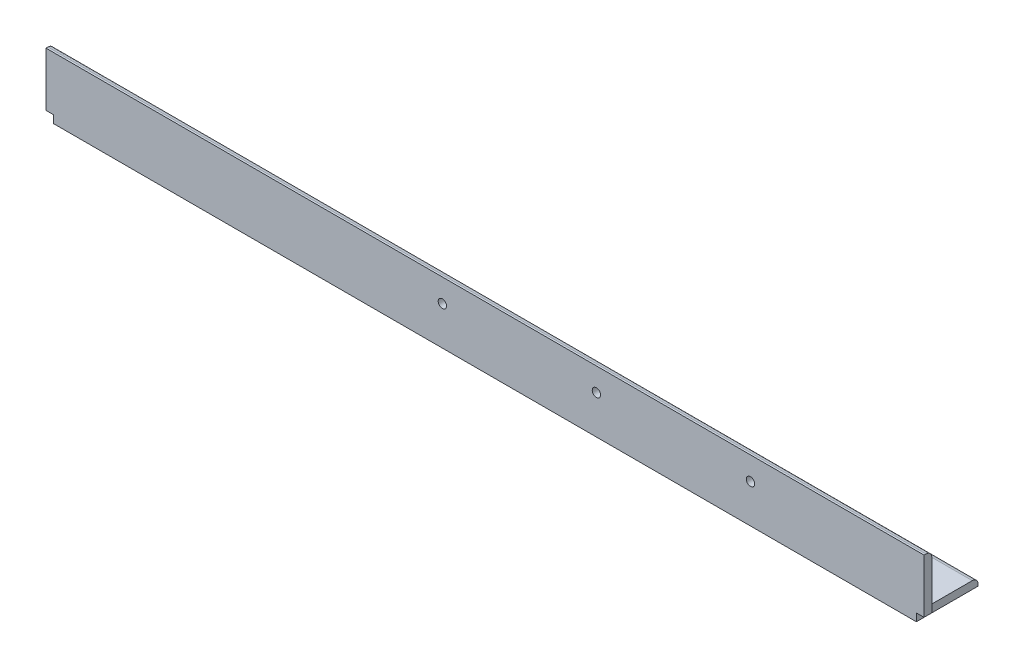
ISO-10303-21;
HEADER;
FILE_DESCRIPTION(('STEP AP214'),'2;1');
FILE_NAME('part.step','',(''),(''),'','','');
FILE_SCHEMA(('AUTOMOTIVE_DESIGN { 1 0 10303 214 1 1 1 1 }'));
ENDSEC;
DATA;
#1=APPLICATION_CONTEXT('core data for automotive mechanical design processes');
#2=APPLICATION_PROTOCOL_DEFINITION('international standard','automotive_design',2000,#1);
#3=PRODUCT_CONTEXT('',#1,'mechanical');
#4=PRODUCT('Part','Part','',(#3));
#5=PRODUCT_RELATED_PRODUCT_CATEGORY('part','',(#4));
#6=PRODUCT_DEFINITION_FORMATION('','',#4);
#7=PRODUCT_DEFINITION_CONTEXT('part definition',#1,'design');
#8=PRODUCT_DEFINITION('design','',#6,#7);
#9=PRODUCT_DEFINITION_SHAPE('','',#8);
#10=(LENGTH_UNIT() NAMED_UNIT(*) SI_UNIT(.MILLI.,.METRE.));
#11=(NAMED_UNIT(*) PLANE_ANGLE_UNIT() SI_UNIT($,.RADIAN.));
#12=(NAMED_UNIT(*) SI_UNIT($,.STERADIAN.) SOLID_ANGLE_UNIT());
#13=UNCERTAINTY_MEASURE_WITH_UNIT(LENGTH_MEASURE(1.E-05),#10,'distance_accuracy_value','');
#14=(GEOMETRIC_REPRESENTATION_CONTEXT(3) GLOBAL_UNCERTAINTY_ASSIGNED_CONTEXT((#13)) GLOBAL_UNIT_ASSIGNED_CONTEXT((#10,
#11,#12)) REPRESENTATION_CONTEXT('',''));
#15=CARTESIAN_POINT('',(0.,0.,0.));
#16=DIRECTION('',(0.,0.,1.));
#17=DIRECTION('',(1.,0.,0.));
#18=AXIS2_PLACEMENT_3D('',#15,#16,#17);
#19=CARTESIAN_POINT('',(180.975,0.,-25.4));
#20=DIRECTION('',(0.,1.,0.));
#21=DIRECTION('',(0.,0.,1.));
#22=AXIS2_PLACEMENT_3D('',#19,#20,#21);
#23=PLANE('',#22);
#24=CARTESIAN_POINT('',(-131.953,0.,-13.335));
#25=DIRECTION('',(0.,1.,0.));
#26=DIRECTION('',(0.,0.,1.));
#27=AXIS2_PLACEMENT_3D('',#24,#25,#26);
#28=CIRCLE('',#27,1.72719999999998);
#29=CARTESIAN_POINT('',(-131.953,0.,-11.6078));
#30=VERTEX_POINT('',#29);
#31=EDGE_CURVE('E334',#30,#30,#28,.T.);
#32=ORIENTED_EDGE('',*,*,#31,.T.);
#33=EDGE_LOOP('',(#32));
#34=FACE_BOUND('',#33,.T.);
#35=CARTESIAN_POINT('',(131.953,0.,-13.335));
#36=DIRECTION('',(0.,1.,0.));
#37=DIRECTION('',(0.,0.,1.));
#38=AXIS2_PLACEMENT_3D('',#35,#36,#37);
#39=CIRCLE('',#38,1.72719999999998);
#40=CARTESIAN_POINT('',(131.953,0.,-11.6078));
#41=VERTEX_POINT('',#40);
#42=EDGE_CURVE('E333',#41,#41,#39,.T.);
#43=ORIENTED_EDGE('',*,*,#42,.T.);
#44=EDGE_LOOP('',(#43));
#45=FACE_BOUND('',#44,.T.);
#46=DIRECTION('',(0.,0.,-1.));
#47=VECTOR('',#46,1.);
#48=CARTESIAN_POINT('',(-177.8,0.,0.));
#49=LINE('',#48,#47);
#50=CARTESIAN_POINT('',(-177.8,0.,0.));
#51=VERTEX_POINT('',#50);
#52=CARTESIAN_POINT('',(-177.8,0.,-25.4));
#53=VERTEX_POINT('',#52);
#54=EDGE_CURVE('E134',#51,#53,#49,.T.);
#55=ORIENTED_EDGE('',*,*,#54,.T.);
#56=DIRECTION('',(-1.,0.,0.));
#57=VECTOR('',#56,1.);
#58=CARTESIAN_POINT('',(180.975,0.,-25.4));
#59=LINE('',#58,#57);
#60=CARTESIAN_POINT('',(177.8,0.,-25.4));
#61=VERTEX_POINT('',#60);
#62=EDGE_CURVE('E203',#61,#53,#59,.T.);
#63=ORIENTED_EDGE('',*,*,#62,.F.);
#64=DIRECTION('',(0.,0.,-1.));
#65=VECTOR('',#64,1.);
#66=CARTESIAN_POINT('',(177.8,0.,0.));
#67=LINE('',#66,#65);
#68=CARTESIAN_POINT('',(177.8,0.,0.));
#69=VERTEX_POINT('',#68);
#70=EDGE_CURVE('E172',#69,#61,#67,.T.);
#71=ORIENTED_EDGE('',*,*,#70,.F.);
#72=DIRECTION('',(-1.,0.,0.));
#73=VECTOR('',#72,1.);
#74=CARTESIAN_POINT('',(180.975,0.,0.));
#75=LINE('',#74,#73);
#76=EDGE_CURVE('E191',#69,#51,#75,.T.);
#77=ORIENTED_EDGE('',*,*,#76,.T.);
#78=EDGE_LOOP('',(#55,#63,#71,#77));
#79=FACE_BOUND('',#78,.T.);
#80=ADVANCED_FACE('F35',(#34,#45,#79),#23,.F.);
#81=CARTESIAN_POINT('',(180.975,3.175,-25.4));
#82=DIRECTION('',(0.,0.,1.));
#83=DIRECTION('',(1.,0.,0.));
#84=AXIS2_PLACEMENT_3D('',#81,#82,#83);
#85=PLANE('',#84);
#86=DIRECTION('',(0.,1.,0.));
#87=VECTOR('',#86,1.);
#88=CARTESIAN_POINT('',(-177.8,3.175,-25.4));
#89=LINE('',#88,#87);
#90=CARTESIAN_POINT('',(-177.8,0.812800000000003,-25.4));
#91=VERTEX_POINT('',#90);
#92=EDGE_CURVE('E155',#53,#91,#89,.T.);
#93=ORIENTED_EDGE('',*,*,#92,.T.);
#94=DIRECTION('',(-1.,0.,0.));
#95=VECTOR('',#94,1.);
#96=CARTESIAN_POINT('',(180.975,0.812800000000003,-25.4));
#97=LINE('',#96,#95);
#98=CARTESIAN_POINT('',(177.8,0.812800000000003,-25.4));
#99=VERTEX_POINT('',#98);
#100=EDGE_CURVE('E43',#91,#99,#97,.F.);
#101=ORIENTED_EDGE('',*,*,#100,.T.);
#102=DIRECTION('',(0.,1.,0.));
#103=VECTOR('',#102,1.);
#104=CARTESIAN_POINT('',(177.8,3.175,-25.4));
#105=LINE('',#104,#103);
#106=EDGE_CURVE('E165',#61,#99,#105,.T.);
#107=ORIENTED_EDGE('',*,*,#106,.F.);
#108=ORIENTED_EDGE('',*,*,#62,.T.);
#109=EDGE_LOOP('',(#93,#101,#107,#108));
#110=FACE_BOUND('',#109,.T.);
#111=ADVANCED_FACE('F254',(#110),#85,.F.);
#112=CARTESIAN_POINT('',(180.975,3.175,-3.175));
#113=DIRECTION('',(0.,-1.,0.));
#114=DIRECTION('',(0.,0.,-1.));
#115=AXIS2_PLACEMENT_3D('',#112,#113,#114);
#116=PLANE('',#115);
#117=CARTESIAN_POINT('',(-131.953,3.175,-13.335));
#118=DIRECTION('',(0.,1.,0.));
#119=DIRECTION('',(0.,0.,1.));
#120=AXIS2_PLACEMENT_3D('',#117,#118,#119);
#121=CIRCLE('',#120,1.72719999999998);
#122=CARTESIAN_POINT('',(-131.953,3.175,-11.6078));
#123=VERTEX_POINT('',#122);
#124=EDGE_CURVE('E329',#123,#123,#121,.T.);
#125=ORIENTED_EDGE('',*,*,#124,.F.);
#126=EDGE_LOOP('',(#125));
#127=FACE_BOUND('',#126,.T.);
#128=CARTESIAN_POINT('',(131.953,3.175,-13.335));
#129=DIRECTION('',(0.,1.,0.));
#130=DIRECTION('',(0.,0.,1.));
#131=AXIS2_PLACEMENT_3D('',#128,#129,#130);
#132=CIRCLE('',#131,1.72719999999998);
#133=CARTESIAN_POINT('',(131.953,3.175,-11.6078));
#134=VERTEX_POINT('',#133);
#135=EDGE_CURVE('E332',#134,#134,#132,.T.);
#136=ORIENTED_EDGE('',*,*,#135,.F.);
#137=EDGE_LOOP('',(#136));
#138=FACE_BOUND('',#137,.T.);
#139=DIRECTION('',(0.,0.,-1.));
#140=VECTOR('',#139,1.);
#141=CARTESIAN_POINT('',(177.8,3.175,0.));
#142=LINE('',#141,#140);
#143=CARTESIAN_POINT('',(177.8,3.175,-6.35));
#144=VERTEX_POINT('',#143);
#145=CARTESIAN_POINT('',(177.8,3.175,-23.0378));
#146=VERTEX_POINT('',#145);
#147=EDGE_CURVE('E181',#144,#146,#142,.T.);
#148=ORIENTED_EDGE('',*,*,#147,.T.);
#149=DIRECTION('',(-1.,0.,0.));
#150=VECTOR('',#149,1.);
#151=CARTESIAN_POINT('',(180.975,3.175,-23.0378));
#152=LINE('',#151,#150);
#153=CARTESIAN_POINT('',(-177.8,3.175,-23.0378));
#154=VERTEX_POINT('',#153);
#155=EDGE_CURVE('E229',#146,#154,#152,.T.);
#156=ORIENTED_EDGE('',*,*,#155,.T.);
#157=DIRECTION('',(0.,0.,-1.));
#158=VECTOR('',#157,1.);
#159=CARTESIAN_POINT('',(-177.8,3.175,0.));
#160=LINE('',#159,#158);
#161=CARTESIAN_POINT('',(-177.8,3.175,-6.35));
#162=VERTEX_POINT('',#161);
#163=EDGE_CURVE('E148',#162,#154,#160,.T.);
#164=ORIENTED_EDGE('',*,*,#163,.F.);
#165=DIRECTION('',(-1.,0.,0.));
#166=VECTOR('',#165,1.);
#167=CARTESIAN_POINT('',(177.8,3.175,-6.35));
#168=LINE('',#167,#166);
#169=EDGE_CURVE('E214',#162,#144,#168,.F.);
#170=ORIENTED_EDGE('',*,*,#169,.T.);
#171=EDGE_LOOP('',(#148,#156,#164,#170));
#172=FACE_BOUND('',#171,.T.);
#173=ADVANCED_FACE('F236',(#127,#138,#172),#116,.F.);
#174=CARTESIAN_POINT('',(180.975,0.,0.));
#175=DIRECTION('',(0.,0.,-1.));
#176=DIRECTION('',(-1.,0.,0.));
#177=AXIS2_PLACEMENT_3D('',#174,#175,#176);
#178=PLANE('',#177);
#179=CARTESIAN_POINT('',(109.4105,15.875,0.));
#180=DIRECTION('',(0.,0.,1.));
#181=DIRECTION('',(1.,0.,0.));
#182=AXIS2_PLACEMENT_3D('',#179,#180,#181);
#183=CIRCLE('',#182,1.72719999999998);
#184=CARTESIAN_POINT('',(111.1377,15.875,0.));
#185=VERTEX_POINT('',#184);
#186=EDGE_CURVE('E337',#185,#185,#183,.T.);
#187=ORIENTED_EDGE('',*,*,#186,.F.);
#188=EDGE_LOOP('',(#187));
#189=FACE_BOUND('',#188,.T.);
#190=CARTESIAN_POINT('',(45.9105,15.875,0.));
#191=DIRECTION('',(0.,0.,1.));
#192=DIRECTION('',(1.,0.,0.));
#193=AXIS2_PLACEMENT_3D('',#190,#191,#192);
#194=CIRCLE('',#193,1.72719999999998);
#195=CARTESIAN_POINT('',(47.6377,15.875,0.));
#196=VERTEX_POINT('',#195);
#197=EDGE_CURVE('E347',#196,#196,#194,.T.);
#198=ORIENTED_EDGE('',*,*,#197,.F.);
#199=EDGE_LOOP('',(#198));
#200=FACE_BOUND('',#199,.T.);
#201=CARTESIAN_POINT('',(-17.5895,15.875,0.));
#202=DIRECTION('',(0.,0.,1.));
#203=DIRECTION('',(1.,0.,0.));
#204=AXIS2_PLACEMENT_3D('',#201,#202,#203);
#205=CIRCLE('',#204,1.72719999999999);
#206=CARTESIAN_POINT('',(-15.8623,15.875,0.));
#207=VERTEX_POINT('',#206);
#208=EDGE_CURVE('E352',#207,#207,#205,.T.);
#209=ORIENTED_EDGE('',*,*,#208,.F.);
#210=EDGE_LOOP('',(#209));
#211=FACE_BOUND('',#210,.T.);
#212=DIRECTION('',(0.,1.,0.));
#213=VECTOR('',#212,1.);
#214=CARTESIAN_POINT('',(-177.8,3.175,0.));
#215=LINE('',#214,#213);
#216=CARTESIAN_POINT('',(-177.8,3.175,0.));
#217=VERTEX_POINT('',#216);
#218=EDGE_CURVE('E128',#51,#217,#215,.T.);
#219=ORIENTED_EDGE('',*,*,#218,.F.);
#220=ORIENTED_EDGE('',*,*,#76,.F.);
#221=DIRECTION('',(0.,1.,0.));
#222=VECTOR('',#221,1.);
#223=CARTESIAN_POINT('',(177.8,3.175,0.));
#224=LINE('',#223,#222);
#225=CARTESIAN_POINT('',(177.8,3.175,0.));
#226=VERTEX_POINT('',#225);
#227=EDGE_CURVE('E166',#69,#226,#224,.T.);
#228=ORIENTED_EDGE('',*,*,#227,.T.);
#229=DIRECTION('',(1.,0.,0.));
#230=VECTOR('',#229,1.);
#231=CARTESIAN_POINT('',(180.975,3.175,0.));
#232=LINE('',#231,#230);
#233=CARTESIAN_POINT('',(180.975,3.175,0.));
#234=VERTEX_POINT('',#233);
#235=EDGE_CURVE('E169',#226,#234,#232,.T.);
#236=ORIENTED_EDGE('',*,*,#235,.T.);
#237=DIRECTION('',(0.,-1.,0.));
#238=VECTOR('',#237,1.);
#239=CARTESIAN_POINT('',(180.975,0.,0.));
#240=LINE('',#239,#238);
#241=CARTESIAN_POINT('',(180.975,25.4,0.));
#242=VERTEX_POINT('',#241);
#243=EDGE_CURVE('E188',#242,#234,#240,.T.);
#244=ORIENTED_EDGE('',*,*,#243,.F.);
#245=DIRECTION('',(-1.,0.,0.));
#246=VECTOR('',#245,1.);
#247=CARTESIAN_POINT('',(180.975,25.4,0.));
#248=LINE('',#247,#246);
#249=CARTESIAN_POINT('',(-180.975,25.4,0.));
#250=VERTEX_POINT('',#249);
#251=EDGE_CURVE('E198',#242,#250,#248,.T.);
#252=ORIENTED_EDGE('',*,*,#251,.T.);
#253=DIRECTION('',(0.,-1.,0.));
#254=VECTOR('',#253,1.);
#255=CARTESIAN_POINT('',(-180.975,0.,0.));
#256=LINE('',#255,#254);
#257=CARTESIAN_POINT('',(-180.975,3.175,0.));
#258=VERTEX_POINT('',#257);
#259=EDGE_CURVE('E154',#250,#258,#256,.T.);
#260=ORIENTED_EDGE('',*,*,#259,.T.);
#261=DIRECTION('',(-1.,0.,0.));
#262=VECTOR('',#261,1.);
#263=CARTESIAN_POINT('',(-180.975,3.175,0.));
#264=LINE('',#263,#262);
#265=EDGE_CURVE('E140',#217,#258,#264,.T.);
#266=ORIENTED_EDGE('',*,*,#265,.F.);
#267=EDGE_LOOP('',(#219,#220,#228,#236,#244,#252,#260,#266));
#268=FACE_BOUND('',#267,.T.);
#269=ADVANCED_FACE('F151',(#189,#200,#211,#268),#178,.F.);
#270=CARTESIAN_POINT('',(-180.975,0.,0.));
#271=DIRECTION('',(-1.,0.,0.));
#272=DIRECTION('',(0.,0.,1.));
#273=AXIS2_PLACEMENT_3D('',#270,#271,#272);
#274=PLANE('',#273);
#275=DIRECTION('',(0.,0.,1.));
#276=VECTOR('',#275,1.);
#277=CARTESIAN_POINT('',(-180.975,25.4,0.));
#278=LINE('',#277,#276);
#279=CARTESIAN_POINT('',(-180.975,25.4,-0.8128));
#280=VERTEX_POINT('',#279);
#281=EDGE_CURVE('E194',#280,#250,#278,.T.);
#282=ORIENTED_EDGE('',*,*,#281,.F.);
#283=CARTESIAN_POINT('',(-180.975,23.0378,-0.8128));
#284=DIRECTION('',(-1.,0.,0.));
#285=DIRECTION('',(0.,0.,1.));
#286=AXIS2_PLACEMENT_3D('',#283,#284,#285);
#287=CIRCLE('',#286,2.3622);
#288=CARTESIAN_POINT('',(-180.975,23.0378,-3.175));
#289=VERTEX_POINT('',#288);
#290=EDGE_CURVE('E223',#280,#289,#287,.T.);
#291=ORIENTED_EDGE('',*,*,#290,.T.);
#292=DIRECTION('',(0.,1.,0.));
#293=VECTOR('',#292,1.);
#294=CARTESIAN_POINT('',(-180.975,25.4,-3.175));
#295=LINE('',#294,#293);
#296=CARTESIAN_POINT('',(-180.975,3.175,-3.175));
#297=VERTEX_POINT('',#296);
#298=EDGE_CURVE('E177',#297,#289,#295,.T.);
#299=ORIENTED_EDGE('',*,*,#298,.F.);
#300=DIRECTION('',(0.,0.,-1.));
#301=VECTOR('',#300,1.);
#302=CARTESIAN_POINT('',(-180.975,3.175,0.));
#303=LINE('',#302,#301);
#304=EDGE_CURVE('E139',#258,#297,#303,.T.);
#305=ORIENTED_EDGE('',*,*,#304,.F.);
#306=ORIENTED_EDGE('',*,*,#259,.F.);
#307=EDGE_LOOP('',(#282,#291,#299,#305,#306));
#308=FACE_BOUND('',#307,.T.);
#309=ADVANCED_FACE('F310',(#308),#274,.T.);
#310=CARTESIAN_POINT('',(180.975,25.4,-3.175));
#311=DIRECTION('',(0.,0.,1.));
#312=DIRECTION('',(1.,0.,0.));
#313=AXIS2_PLACEMENT_3D('',#310,#311,#312);
#314=PLANE('',#313);
#315=CARTESIAN_POINT('',(109.4105,15.875,-3.175));
#316=DIRECTION('',(0.,0.,1.));
#317=DIRECTION('',(1.,0.,0.));
#318=AXIS2_PLACEMENT_3D('',#315,#316,#317);
#319=CIRCLE('',#318,1.72719999999999);
#320=CARTESIAN_POINT('',(111.1377,15.875,-3.175));
#321=VERTEX_POINT('',#320);
#322=EDGE_CURVE('E344',#321,#321,#319,.T.);
#323=ORIENTED_EDGE('',*,*,#322,.T.);
#324=EDGE_LOOP('',(#323));
#325=FACE_BOUND('',#324,.T.);
#326=CARTESIAN_POINT('',(45.9105,15.875,-3.175));
#327=DIRECTION('',(0.,0.,1.));
#328=DIRECTION('',(1.,0.,0.));
#329=AXIS2_PLACEMENT_3D('',#326,#327,#328);
#330=CIRCLE('',#329,1.72719999999999);
#331=CARTESIAN_POINT('',(47.6377,15.875,-3.175));
#332=VERTEX_POINT('',#331);
#333=EDGE_CURVE('E350',#332,#332,#330,.T.);
#334=ORIENTED_EDGE('',*,*,#333,.T.);
#335=EDGE_LOOP('',(#334));
#336=FACE_BOUND('',#335,.T.);
#337=CARTESIAN_POINT('',(-17.5895,15.875,-3.175));
#338=DIRECTION('',(0.,0.,1.));
#339=DIRECTION('',(1.,0.,0.));
#340=AXIS2_PLACEMENT_3D('',#337,#338,#339);
#341=CIRCLE('',#340,1.72719999999999);
#342=CARTESIAN_POINT('',(-15.8623,15.875,-3.175));
#343=VERTEX_POINT('',#342);
#344=EDGE_CURVE('E157',#343,#343,#341,.T.);
#345=ORIENTED_EDGE('',*,*,#344,.T.);
#346=EDGE_LOOP('',(#345));
#347=FACE_BOUND('',#346,.T.);
#348=ORIENTED_EDGE('',*,*,#298,.T.);
#349=DIRECTION('',(-1.,0.,0.));
#350=VECTOR('',#349,1.);
#351=CARTESIAN_POINT('',(180.975,23.0378,-3.175));
#352=LINE('',#351,#350);
#353=CARTESIAN_POINT('',(180.975,23.0378,-3.175));
#354=VERTEX_POINT('',#353);
#355=EDGE_CURVE('E225',#289,#354,#352,.F.);
#356=ORIENTED_EDGE('',*,*,#355,.T.);
#357=DIRECTION('',(0.,1.,0.));
#358=VECTOR('',#357,1.);
#359=CARTESIAN_POINT('',(180.975,25.4,-3.175));
#360=LINE('',#359,#358);
#361=CARTESIAN_POINT('',(180.975,3.175,-3.175));
#362=VERTEX_POINT('',#361);
#363=EDGE_CURVE('E183',#362,#354,#360,.T.);
#364=ORIENTED_EDGE('',*,*,#363,.F.);
#365=DIRECTION('',(-1.,0.,0.));
#366=VECTOR('',#365,1.);
#367=CARTESIAN_POINT('',(180.975,3.175,-3.175));
#368=LINE('',#367,#366);
#369=CARTESIAN_POINT('',(177.8,3.175,-3.175));
#370=VERTEX_POINT('',#369);
#371=EDGE_CURVE('E200',#362,#370,#368,.T.);
#372=ORIENTED_EDGE('',*,*,#371,.T.);
#373=DIRECTION('',(0.,1.,0.));
#374=VECTOR('',#373,1.);
#375=CARTESIAN_POINT('',(177.8,3.175,-3.175));
#376=LINE('',#375,#374);
#377=CARTESIAN_POINT('',(177.8,6.35,-3.175));
#378=VERTEX_POINT('',#377);
#379=EDGE_CURVE('E206',#370,#378,#376,.T.);
#380=ORIENTED_EDGE('',*,*,#379,.T.);
#381=DIRECTION('',(-1.,0.,0.));
#382=VECTOR('',#381,1.);
#383=CARTESIAN_POINT('',(-177.8,6.35,-3.175));
#384=LINE('',#383,#382);
#385=CARTESIAN_POINT('',(-177.8,6.35,-3.175));
#386=VERTEX_POINT('',#385);
#387=EDGE_CURVE('E209',#378,#386,#384,.T.);
#388=ORIENTED_EDGE('',*,*,#387,.T.);
#389=DIRECTION('',(0.,-1.,0.));
#390=VECTOR('',#389,1.);
#391=CARTESIAN_POINT('',(-177.8,25.4,-3.175));
#392=LINE('',#391,#390);
#393=CARTESIAN_POINT('',(-177.8,3.175,-3.175));
#394=VERTEX_POINT('',#393);
#395=EDGE_CURVE('E212',#386,#394,#392,.T.);
#396=ORIENTED_EDGE('',*,*,#395,.T.);
#397=DIRECTION('',(1.,0.,0.));
#398=VECTOR('',#397,1.);
#399=CARTESIAN_POINT('',(180.975,3.175,-3.175));
#400=LINE('',#399,#398);
#401=EDGE_CURVE('E147',#297,#394,#400,.T.);
#402=ORIENTED_EDGE('',*,*,#401,.F.);
#403=EDGE_LOOP('',(#348,#356,#364,#372,#380,#388,#396,#402));
#404=FACE_BOUND('',#403,.T.);
#405=ADVANCED_FACE('F313',(#325,#336,#347,#404),#314,.F.);
#406=CARTESIAN_POINT('',(180.975,25.4,0.));
#407=DIRECTION('',(0.,-1.,0.));
#408=DIRECTION('',(0.,0.,-1.));
#409=AXIS2_PLACEMENT_3D('',#406,#407,#408);
#410=PLANE('',#409);
#411=DIRECTION('',(0.,0.,1.));
#412=VECTOR('',#411,1.);
#413=CARTESIAN_POINT('',(180.975,25.4,0.));
#414=LINE('',#413,#412);
#415=CARTESIAN_POINT('',(180.975,25.4,-0.8128));
#416=VERTEX_POINT('',#415);
#417=EDGE_CURVE('E186',#416,#242,#414,.T.);
#418=ORIENTED_EDGE('',*,*,#417,.F.);
#419=DIRECTION('',(-1.,0.,0.));
#420=VECTOR('',#419,1.);
#421=CARTESIAN_POINT('',(180.975,25.4,-0.8128));
#422=LINE('',#421,#420);
#423=EDGE_CURVE('E220',#416,#280,#422,.T.);
#424=ORIENTED_EDGE('',*,*,#423,.T.);
#425=ORIENTED_EDGE('',*,*,#281,.T.);
#426=ORIENTED_EDGE('',*,*,#251,.F.);
#427=EDGE_LOOP('',(#418,#424,#425,#426));
#428=FACE_BOUND('',#427,.T.);
#429=ADVANCED_FACE('F308',(#428),#410,.F.);
#430=CARTESIAN_POINT('',(180.975,0.,0.));
#431=DIRECTION('',(-1.,0.,0.));
#432=DIRECTION('',(0.,0.,1.));
#433=AXIS2_PLACEMENT_3D('',#430,#431,#432);
#434=PLANE('',#433);
#435=ORIENTED_EDGE('',*,*,#363,.T.);
#436=CARTESIAN_POINT('',(180.975,23.0378,-0.8128));
#437=DIRECTION('',(-1.,0.,0.));
#438=DIRECTION('',(0.,0.,1.));
#439=AXIS2_PLACEMENT_3D('',#436,#437,#438);
#440=CIRCLE('',#439,2.3622);
#441=EDGE_CURVE('E227',#354,#416,#440,.F.);
#442=ORIENTED_EDGE('',*,*,#441,.T.);
#443=ORIENTED_EDGE('',*,*,#417,.T.);
#444=ORIENTED_EDGE('',*,*,#243,.T.);
#445=DIRECTION('',(0.,0.,-1.));
#446=VECTOR('',#445,1.);
#447=CARTESIAN_POINT('',(180.975,3.175,0.));
#448=LINE('',#447,#446);
#449=EDGE_CURVE('E174',#234,#362,#448,.T.);
#450=ORIENTED_EDGE('',*,*,#449,.T.);
#451=EDGE_LOOP('',(#435,#442,#443,#444,#450));
#452=FACE_BOUND('',#451,.T.);
#453=ADVANCED_FACE('F303',(#452),#434,.F.);
#454=CARTESIAN_POINT('',(180.975,3.175,0.));
#455=DIRECTION('',(0.,1.,0.));
#456=DIRECTION('',(0.,0.,1.));
#457=AXIS2_PLACEMENT_3D('',#454,#455,#456);
#458=PLANE('',#457);
#459=ORIENTED_EDGE('',*,*,#449,.F.);
#460=ORIENTED_EDGE('',*,*,#235,.F.);
#461=EDGE_CURVE('E178',#226,#370,#142,.T.);
#462=ORIENTED_EDGE('',*,*,#461,.T.);
#463=ORIENTED_EDGE('',*,*,#371,.F.);
#464=EDGE_LOOP('',(#459,#460,#462,#463));
#465=FACE_BOUND('',#464,.T.);
#466=ADVANCED_FACE('F300',(#465),#458,.F.);
#467=CARTESIAN_POINT('',(177.8,3.175,0.));
#468=DIRECTION('',(-1.,0.,0.));
#469=DIRECTION('',(0.,0.,1.));
#470=AXIS2_PLACEMENT_3D('',#467,#468,#469);
#471=PLANE('',#470);
#472=ORIENTED_EDGE('',*,*,#106,.T.);
#473=CARTESIAN_POINT('',(177.8,0.812800000000003,-23.0378));
#474=DIRECTION('',(-1.,0.,0.));
#475=DIRECTION('',(0.,0.,1.));
#476=AXIS2_PLACEMENT_3D('',#473,#474,#475);
#477=CIRCLE('',#476,2.3622);
#478=EDGE_CURVE('E11',#99,#146,#477,.F.);
#479=ORIENTED_EDGE('',*,*,#478,.T.);
#480=ORIENTED_EDGE('',*,*,#147,.F.);
#481=CARTESIAN_POINT('',(177.8,6.35,-6.35));
#482=DIRECTION('',(-1.,0.,0.));
#483=DIRECTION('',(0.,0.,1.));
#484=AXIS2_PLACEMENT_3D('',#481,#482,#483);
#485=CIRCLE('',#484,3.175);
#486=EDGE_CURVE('E218',#144,#378,#485,.T.);
#487=ORIENTED_EDGE('',*,*,#486,.T.);
#488=ORIENTED_EDGE('',*,*,#379,.F.);
#489=ORIENTED_EDGE('',*,*,#461,.F.);
#490=ORIENTED_EDGE('',*,*,#227,.F.);
#491=ORIENTED_EDGE('',*,*,#70,.T.);
#492=EDGE_LOOP('',(#472,#479,#480,#487,#488,#489,#490,#491));
#493=FACE_BOUND('',#492,.T.);
#494=ADVANCED_FACE('F246',(#493),#471,.F.);
#495=CARTESIAN_POINT('',(-180.975,3.175,0.));
#496=DIRECTION('',(0.,-1.,0.));
#497=DIRECTION('',(0.,0.,-1.));
#498=AXIS2_PLACEMENT_3D('',#495,#496,#497);
#499=PLANE('',#498);
#500=ORIENTED_EDGE('',*,*,#401,.T.);
#501=EDGE_CURVE('E132',#217,#394,#160,.T.);
#502=ORIENTED_EDGE('',*,*,#501,.F.);
#503=ORIENTED_EDGE('',*,*,#265,.T.);
#504=ORIENTED_EDGE('',*,*,#304,.T.);
#505=EDGE_LOOP('',(#500,#502,#503,#504));
#506=FACE_BOUND('',#505,.T.);
#507=ADVANCED_FACE('F144',(#506),#499,.T.);
#508=CARTESIAN_POINT('',(-177.8,3.175,0.));
#509=DIRECTION('',(-1.,0.,0.));
#510=DIRECTION('',(0.,0.,1.));
#511=AXIS2_PLACEMENT_3D('',#508,#509,#510);
#512=PLANE('',#511);
#513=ORIENTED_EDGE('',*,*,#163,.T.);
#514=CARTESIAN_POINT('',(-177.8,0.812800000000003,-23.0378));
#515=DIRECTION('',(-1.,0.,0.));
#516=DIRECTION('',(0.,0.,1.));
#517=AXIS2_PLACEMENT_3D('',#514,#515,#516);
#518=CIRCLE('',#517,2.3622);
#519=EDGE_CURVE('E57',#154,#91,#518,.T.);
#520=ORIENTED_EDGE('',*,*,#519,.T.);
#521=ORIENTED_EDGE('',*,*,#92,.F.);
#522=ORIENTED_EDGE('',*,*,#54,.F.);
#523=ORIENTED_EDGE('',*,*,#218,.T.);
#524=ORIENTED_EDGE('',*,*,#501,.T.);
#525=ORIENTED_EDGE('',*,*,#395,.F.);
#526=CARTESIAN_POINT('',(-177.8,6.35,-6.35));
#527=DIRECTION('',(-1.,0.,0.));
#528=DIRECTION('',(0.,0.,1.));
#529=AXIS2_PLACEMENT_3D('',#526,#527,#528);
#530=CIRCLE('',#529,3.175);
#531=EDGE_CURVE('E216',#386,#162,#530,.F.);
#532=ORIENTED_EDGE('',*,*,#531,.T.);
#533=EDGE_LOOP('',(#513,#520,#521,#522,#523,#524,#525,#532));
#534=FACE_BOUND('',#533,.T.);
#535=ADVANCED_FACE('F130',(#534),#512,.T.);
#536=CARTESIAN_POINT('',(-17.5895,15.875,0.));
#537=DIRECTION('',(0.,0.,1.));
#538=DIRECTION('',(1.,0.,0.));
#539=AXIS2_PLACEMENT_3D('',#536,#537,#538);
#540=CYLINDRICAL_SURFACE('',#539,1.72719999999999);
#541=ORIENTED_EDGE('',*,*,#344,.F.);
#542=EDGE_LOOP('',(#541));
#543=FACE_BOUND('',#542,.T.);
#544=ORIENTED_EDGE('',*,*,#208,.T.);
#545=EDGE_LOOP('',(#544));
#546=FACE_BOUND('',#545,.T.);
#547=ADVANCED_FACE('F292',(#543,#546),#540,.F.);
#548=CARTESIAN_POINT('',(45.9105,15.875,0.));
#549=DIRECTION('',(0.,0.,1.));
#550=DIRECTION('',(1.,0.,0.));
#551=AXIS2_PLACEMENT_3D('',#548,#549,#550);
#552=CYLINDRICAL_SURFACE('',#551,1.72719999999999);
#553=ORIENTED_EDGE('',*,*,#333,.F.);
#554=EDGE_LOOP('',(#553));
#555=FACE_BOUND('',#554,.T.);
#556=ORIENTED_EDGE('',*,*,#197,.T.);
#557=EDGE_LOOP('',(#556));
#558=FACE_BOUND('',#557,.T.);
#559=ADVANCED_FACE('F288',(#555,#558),#552,.F.);
#560=CARTESIAN_POINT('',(109.4105,15.875,0.));
#561=DIRECTION('',(0.,0.,1.));
#562=DIRECTION('',(1.,0.,0.));
#563=AXIS2_PLACEMENT_3D('',#560,#561,#562);
#564=CYLINDRICAL_SURFACE('',#563,1.72719999999999);
#565=ORIENTED_EDGE('',*,*,#322,.F.);
#566=EDGE_LOOP('',(#565));
#567=FACE_BOUND('',#566,.T.);
#568=ORIENTED_EDGE('',*,*,#186,.T.);
#569=EDGE_LOOP('',(#568));
#570=FACE_BOUND('',#569,.T.);
#571=ADVANCED_FACE('F280',(#567,#570),#564,.F.);
#572=CARTESIAN_POINT('',(131.953,3.175,-13.335));
#573=DIRECTION('',(0.,1.,0.));
#574=DIRECTION('',(0.,0.,1.));
#575=AXIS2_PLACEMENT_3D('',#572,#573,#574);
#576=CYLINDRICAL_SURFACE('',#575,1.72719999999998);
#577=ORIENTED_EDGE('',*,*,#135,.T.);
#578=EDGE_LOOP('',(#577));
#579=FACE_BOUND('',#578,.T.);
#580=ORIENTED_EDGE('',*,*,#42,.F.);
#581=EDGE_LOOP('',(#580));
#582=FACE_BOUND('',#581,.T.);
#583=ADVANCED_FACE('F273',(#579,#582),#576,.F.);
#584=CARTESIAN_POINT('',(-131.953,3.175,-13.335));
#585=DIRECTION('',(0.,1.,0.));
#586=DIRECTION('',(0.,0.,1.));
#587=AXIS2_PLACEMENT_3D('',#584,#585,#586);
#588=CYLINDRICAL_SURFACE('',#587,1.72719999999998);
#589=ORIENTED_EDGE('',*,*,#124,.T.);
#590=EDGE_LOOP('',(#589));
#591=FACE_BOUND('',#590,.T.);
#592=ORIENTED_EDGE('',*,*,#31,.F.);
#593=EDGE_LOOP('',(#592));
#594=FACE_BOUND('',#593,.T.);
#595=ADVANCED_FACE('F268',(#591,#594),#588,.F.);
#596=CARTESIAN_POINT('',(180.975,6.35,-6.35));
#597=DIRECTION('',(1.,0.,0.));
#598=DIRECTION('',(0.,0.,-1.));
#599=AXIS2_PLACEMENT_3D('',#596,#597,#598);
#600=CYLINDRICAL_SURFACE('',#599,3.175);
#601=ORIENTED_EDGE('',*,*,#486,.F.);
#602=ORIENTED_EDGE('',*,*,#169,.F.);
#603=ORIENTED_EDGE('',*,*,#531,.F.);
#604=ORIENTED_EDGE('',*,*,#387,.F.);
#605=EDGE_LOOP('',(#601,#602,#603,#604));
#606=FACE_BOUND('',#605,.T.);
#607=ADVANCED_FACE('F244',(#606),#600,.F.);
#608=CARTESIAN_POINT('',(180.975,23.0378,-0.8128));
#609=DIRECTION('',(-1.,0.,0.));
#610=DIRECTION('',(0.,0.,1.));
#611=AXIS2_PLACEMENT_3D('',#608,#609,#610);
#612=CYLINDRICAL_SURFACE('',#611,2.3622);
#613=ORIENTED_EDGE('',*,*,#441,.F.);
#614=ORIENTED_EDGE('',*,*,#355,.F.);
#615=ORIENTED_EDGE('',*,*,#290,.F.);
#616=ORIENTED_EDGE('',*,*,#423,.F.);
#617=EDGE_LOOP('',(#613,#614,#615,#616));
#618=FACE_BOUND('',#617,.T.);
#619=ADVANCED_FACE('F248',(#618),#612,.T.);
#620=CARTESIAN_POINT('',(180.975,0.812800000000003,-23.0378));
#621=DIRECTION('',(-1.,0.,0.));
#622=DIRECTION('',(0.,0.,1.));
#623=AXIS2_PLACEMENT_3D('',#620,#621,#622);
#624=CYLINDRICAL_SURFACE('',#623,2.3622);
#625=ORIENTED_EDGE('',*,*,#478,.F.);
#626=ORIENTED_EDGE('',*,*,#100,.F.);
#627=ORIENTED_EDGE('',*,*,#519,.F.);
#628=ORIENTED_EDGE('',*,*,#155,.F.);
#629=EDGE_LOOP('',(#625,#626,#627,#628));
#630=FACE_BOUND('',#629,.T.);
#631=ADVANCED_FACE('F37',(#630),#624,.T.);
#632=CLOSED_SHELL('',(#80,#111,#173,#269,#309,#405,#429,#453,#466,#494,#507,#535,#547,#559,#571,
#583,#595,#607,#619,#631));
#633=MANIFOLD_SOLID_BREP('B2',#632);
#634=ADVANCED_BREP_SHAPE_REPRESENTATION('',(#18,#633),#14);
#635=SHAPE_DEFINITION_REPRESENTATION(#9,#634);
ENDSEC;
END-ISO-10303-21;
